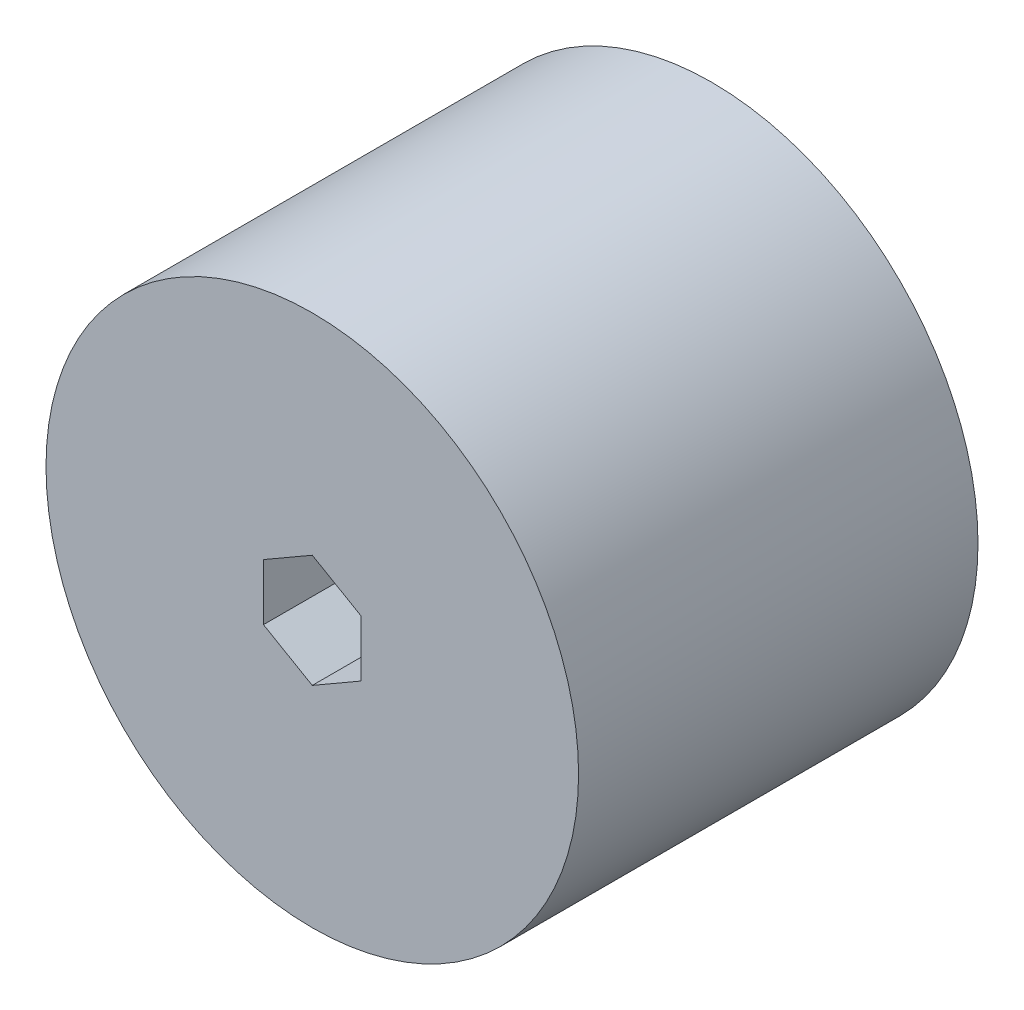
ISO-10303-21;
HEADER;
FILE_DESCRIPTION(('STEP AP214'),'2;1');
FILE_NAME('part.step','',(''),(''),'','','');
FILE_SCHEMA(('AUTOMOTIVE_DESIGN { 1 0 10303 214 1 1 1 1 }'));
ENDSEC;
DATA;
#1=APPLICATION_CONTEXT('core data for automotive mechanical design processes');
#2=APPLICATION_PROTOCOL_DEFINITION('international standard','automotive_design',2000,#1);
#3=PRODUCT_CONTEXT('',#1,'mechanical');
#4=PRODUCT('Part','Part','',(#3));
#5=PRODUCT_RELATED_PRODUCT_CATEGORY('part','',(#4));
#6=PRODUCT_DEFINITION_FORMATION('','',#4);
#7=PRODUCT_DEFINITION_CONTEXT('part definition',#1,'design');
#8=PRODUCT_DEFINITION('design','',#6,#7);
#9=PRODUCT_DEFINITION_SHAPE('','',#8);
#10=(LENGTH_UNIT() NAMED_UNIT(*) SI_UNIT(.MILLI.,.METRE.));
#11=(NAMED_UNIT(*) PLANE_ANGLE_UNIT() SI_UNIT($,.RADIAN.));
#12=(NAMED_UNIT(*) SI_UNIT($,.STERADIAN.) SOLID_ANGLE_UNIT());
#13=UNCERTAINTY_MEASURE_WITH_UNIT(LENGTH_MEASURE(1.E-05),#10,'distance_accuracy_value','');
#14=(GEOMETRIC_REPRESENTATION_CONTEXT(3) GLOBAL_UNCERTAINTY_ASSIGNED_CONTEXT((#13)) GLOBAL_UNIT_ASSIGNED_CONTEXT((#10,
#11,#12)) REPRESENTATION_CONTEXT('',''));
#15=CARTESIAN_POINT('',(0.,0.,0.));
#16=DIRECTION('',(0.,0.,1.));
#17=DIRECTION('',(1.,0.,0.));
#18=AXIS2_PLACEMENT_3D('',#15,#16,#17);
#19=CARTESIAN_POINT('',(0.,0.,57.15));
#20=DIRECTION('',(0.,0.,1.));
#21=DIRECTION('',(1.,0.,0.));
#22=AXIS2_PLACEMENT_3D('',#19,#20,#21);
#23=PLANE('',#22);
#24=CARTESIAN_POINT('',(0.,0.,57.15));
#25=DIRECTION('',(0.,0.,1.));
#26=DIRECTION('',(1.,0.,0.));
#27=AXIS2_PLACEMENT_3D('',#24,#25,#26);
#28=CIRCLE('',#27,38.1);
#29=CARTESIAN_POINT('',(38.1,0.,57.15));
#30=VERTEX_POINT('',#29);
#31=EDGE_CURVE('E11',#30,#30,#28,.T.);
#32=ORIENTED_EDGE('',*,*,#31,.T.);
#33=EDGE_LOOP('',(#32));
#34=FACE_BOUND('',#33,.T.);
#35=DIRECTION('',(-0.866025403784439,-0.5,0.));
#36=VECTOR('',#35,1.);
#37=CARTESIAN_POINT('',(0.,8.06558326057907,57.15));
#38=LINE('',#37,#36);
#39=CARTESIAN_POINT('',(0.,8.06558326057907,57.15));
#40=VERTEX_POINT('',#39);
#41=CARTESIAN_POINT('',(-6.985,4.03279163028954,57.15));
#42=VERTEX_POINT('',#41);
#43=EDGE_CURVE('E108',#40,#42,#38,.T.);
#44=ORIENTED_EDGE('',*,*,#43,.F.);
#45=DIRECTION('',(-0.866025403784439,0.5,0.));
#46=VECTOR('',#45,1.);
#47=CARTESIAN_POINT('',(6.985,4.03279163028954,57.15));
#48=LINE('',#47,#46);
#49=CARTESIAN_POINT('',(6.985,4.03279163028954,57.15));
#50=VERTEX_POINT('',#49);
#51=EDGE_CURVE('E99',#50,#40,#48,.T.);
#52=ORIENTED_EDGE('',*,*,#51,.F.);
#53=DIRECTION('',(0.,1.,0.));
#54=VECTOR('',#53,1.);
#55=CARTESIAN_POINT('',(6.985,-4.03279163028954,57.15));
#56=LINE('',#55,#54);
#57=CARTESIAN_POINT('',(6.985,-4.03279163028954,57.15));
#58=VERTEX_POINT('',#57);
#59=EDGE_CURVE('E133',#58,#50,#56,.T.);
#60=ORIENTED_EDGE('',*,*,#59,.F.);
#61=DIRECTION('',(0.866025403784439,0.5,0.));
#62=VECTOR('',#61,1.);
#63=CARTESIAN_POINT('',(0.,-8.06558326057907,57.15));
#64=LINE('',#63,#62);
#65=CARTESIAN_POINT('',(0.,-8.06558326057907,57.15));
#66=VERTEX_POINT('',#65);
#67=EDGE_CURVE('E130',#66,#58,#64,.T.);
#68=ORIENTED_EDGE('',*,*,#67,.F.);
#69=DIRECTION('',(0.866025403784439,-0.5,0.));
#70=VECTOR('',#69,1.);
#71=CARTESIAN_POINT('',(-6.985,-4.03279163028954,57.15));
#72=LINE('',#71,#70);
#73=CARTESIAN_POINT('',(-6.985,-4.03279163028954,57.15));
#74=VERTEX_POINT('',#73);
#75=EDGE_CURVE('E125',#74,#66,#72,.T.);
#76=ORIENTED_EDGE('',*,*,#75,.F.);
#77=DIRECTION('',(0.,-1.,0.));
#78=VECTOR('',#77,1.);
#79=CARTESIAN_POINT('',(-6.985,4.03279163028954,57.15));
#80=LINE('',#79,#78);
#81=EDGE_CURVE('E121',#42,#74,#80,.T.);
#82=ORIENTED_EDGE('',*,*,#81,.F.);
#83=EDGE_LOOP('',(#44,#52,#60,#68,#76,#82));
#84=FACE_BOUND('',#83,.T.);
#85=ADVANCED_FACE('F45',(#34,#84),#23,.T.);
#86=CARTESIAN_POINT('',(0.,0.,0.));
#87=DIRECTION('',(0.,0.,1.));
#88=DIRECTION('',(1.,0.,0.));
#89=AXIS2_PLACEMENT_3D('',#86,#87,#88);
#90=PLANE('',#89);
#91=CARTESIAN_POINT('',(0.,0.,0.));
#92=DIRECTION('',(0.,0.,1.));
#93=DIRECTION('',(1.,0.,0.));
#94=AXIS2_PLACEMENT_3D('',#91,#92,#93);
#95=CIRCLE('',#94,38.1);
#96=CARTESIAN_POINT('',(38.1,0.,0.));
#97=VERTEX_POINT('',#96);
#98=EDGE_CURVE('E49',#97,#97,#95,.T.);
#99=ORIENTED_EDGE('',*,*,#98,.F.);
#100=EDGE_LOOP('',(#99));
#101=FACE_BOUND('',#100,.T.);
#102=DIRECTION('',(-0.866025403784439,0.5,0.));
#103=VECTOR('',#102,1.);
#104=CARTESIAN_POINT('',(6.985,4.03279163028954,0.));
#105=LINE('',#104,#103);
#106=CARTESIAN_POINT('',(6.985,4.03279163028954,0.));
#107=VERTEX_POINT('',#106);
#108=CARTESIAN_POINT('',(0.,8.06558326057907,0.));
#109=VERTEX_POINT('',#108);
#110=EDGE_CURVE('E69',#107,#109,#105,.T.);
#111=ORIENTED_EDGE('',*,*,#110,.T.);
#112=DIRECTION('',(-0.866025403784439,-0.5,0.));
#113=VECTOR('',#112,1.);
#114=CARTESIAN_POINT('',(0.,8.06558326057907,0.));
#115=LINE('',#114,#113);
#116=CARTESIAN_POINT('',(-6.985,4.03279163028954,0.));
#117=VERTEX_POINT('',#116);
#118=EDGE_CURVE('E115',#109,#117,#115,.T.);
#119=ORIENTED_EDGE('',*,*,#118,.T.);
#120=DIRECTION('',(0.,-1.,0.));
#121=VECTOR('',#120,1.);
#122=CARTESIAN_POINT('',(-6.985,4.03279163028954,0.));
#123=LINE('',#122,#121);
#124=CARTESIAN_POINT('',(-6.985,-4.03279163028954,0.));
#125=VERTEX_POINT('',#124);
#126=EDGE_CURVE('E140',#117,#125,#123,.T.);
#127=ORIENTED_EDGE('',*,*,#126,.T.);
#128=DIRECTION('',(0.866025403784439,-0.5,0.));
#129=VECTOR('',#128,1.);
#130=CARTESIAN_POINT('',(-6.985,-4.03279163028954,0.));
#131=LINE('',#130,#129);
#132=CARTESIAN_POINT('',(0.,-8.06558326057907,0.));
#133=VERTEX_POINT('',#132);
#134=EDGE_CURVE('E144',#125,#133,#131,.T.);
#135=ORIENTED_EDGE('',*,*,#134,.T.);
#136=DIRECTION('',(0.866025403784439,0.5,0.));
#137=VECTOR('',#136,1.);
#138=CARTESIAN_POINT('',(0.,-8.06558326057907,0.));
#139=LINE('',#138,#137);
#140=CARTESIAN_POINT('',(6.985,-4.03279163028954,0.));
#141=VERTEX_POINT('',#140);
#142=EDGE_CURVE('E148',#133,#141,#139,.T.);
#143=ORIENTED_EDGE('',*,*,#142,.T.);
#144=DIRECTION('',(0.,1.,0.));
#145=VECTOR('',#144,1.);
#146=CARTESIAN_POINT('',(6.985,-4.03279163028954,0.));
#147=LINE('',#146,#145);
#148=EDGE_CURVE('E109',#141,#107,#147,.T.);
#149=ORIENTED_EDGE('',*,*,#148,.T.);
#150=EDGE_LOOP('',(#111,#119,#127,#135,#143,#149));
#151=FACE_BOUND('',#150,.T.);
#152=ADVANCED_FACE('F172',(#101,#151),#90,.F.);
#153=CARTESIAN_POINT('',(0.,0.,57.15));
#154=DIRECTION('',(0.,0.,-1.));
#155=DIRECTION('',(-1.,0.,0.));
#156=AXIS2_PLACEMENT_3D('',#153,#154,#155);
#157=CYLINDRICAL_SURFACE('',#156,38.1);
#158=ORIENTED_EDGE('',*,*,#31,.F.);
#159=EDGE_LOOP('',(#158));
#160=FACE_BOUND('',#159,.T.);
#161=ORIENTED_EDGE('',*,*,#98,.T.);
#162=EDGE_LOOP('',(#161));
#163=FACE_BOUND('',#162,.T.);
#164=ADVANCED_FACE('F47',(#160,#163),#157,.T.);
#165=CARTESIAN_POINT('',(6.985,4.03279163028954,57.15));
#166=DIRECTION('',(-0.5,-0.866025403784439,0.));
#167=DIRECTION('',(0.866025403784439,-0.5,0.));
#168=AXIS2_PLACEMENT_3D('',#165,#166,#167);
#169=PLANE('',#168);
#170=ORIENTED_EDGE('',*,*,#110,.F.);
#171=DIRECTION('',(0.,0.,-1.));
#172=VECTOR('',#171,1.);
#173=CARTESIAN_POINT('',(6.985,4.03279163028954,57.15));
#174=LINE('',#173,#172);
#175=EDGE_CURVE('E103',#50,#107,#174,.T.);
#176=ORIENTED_EDGE('',*,*,#175,.F.);
#177=ORIENTED_EDGE('',*,*,#51,.T.);
#178=DIRECTION('',(0.,0.,-1.));
#179=VECTOR('',#178,1.);
#180=CARTESIAN_POINT('',(0.,8.06558326057907,57.15));
#181=LINE('',#180,#179);
#182=EDGE_CURVE('E102',#40,#109,#181,.T.);
#183=ORIENTED_EDGE('',*,*,#182,.T.);
#184=EDGE_LOOP('',(#170,#176,#177,#183));
#185=FACE_BOUND('',#184,.T.);
#186=ADVANCED_FACE('F101',(#185),#169,.T.);
#187=CARTESIAN_POINT('',(0.,8.06558326057907,57.15));
#188=DIRECTION('',(0.5,-0.866025403784439,0.));
#189=DIRECTION('',(0.866025403784439,0.5,0.));
#190=AXIS2_PLACEMENT_3D('',#187,#188,#189);
#191=PLANE('',#190);
#192=ORIENTED_EDGE('',*,*,#118,.F.);
#193=ORIENTED_EDGE('',*,*,#182,.F.);
#194=ORIENTED_EDGE('',*,*,#43,.T.);
#195=DIRECTION('',(0.,0.,-1.));
#196=VECTOR('',#195,1.);
#197=CARTESIAN_POINT('',(-6.985,4.03279163028954,57.15));
#198=LINE('',#197,#196);
#199=EDGE_CURVE('E117',#42,#117,#198,.T.);
#200=ORIENTED_EDGE('',*,*,#199,.T.);
#201=EDGE_LOOP('',(#192,#193,#194,#200));
#202=FACE_BOUND('',#201,.T.);
#203=ADVANCED_FACE('F112',(#202),#191,.T.);
#204=CARTESIAN_POINT('',(-6.985,4.03279163028954,57.15));
#205=DIRECTION('',(1.,0.,0.));
#206=DIRECTION('',(0.,1.,0.));
#207=AXIS2_PLACEMENT_3D('',#204,#205,#206);
#208=PLANE('',#207);
#209=ORIENTED_EDGE('',*,*,#126,.F.);
#210=ORIENTED_EDGE('',*,*,#199,.F.);
#211=ORIENTED_EDGE('',*,*,#81,.T.);
#212=DIRECTION('',(0.,0.,-1.));
#213=VECTOR('',#212,1.);
#214=CARTESIAN_POINT('',(-6.985,-4.03279163028954,57.15));
#215=LINE('',#214,#213);
#216=EDGE_CURVE('E162',#74,#125,#215,.T.);
#217=ORIENTED_EDGE('',*,*,#216,.T.);
#218=EDGE_LOOP('',(#209,#210,#211,#217));
#219=FACE_BOUND('',#218,.T.);
#220=ADVANCED_FACE('F168',(#219),#208,.T.);
#221=CARTESIAN_POINT('',(-6.985,-4.03279163028954,57.15));
#222=DIRECTION('',(0.5,0.866025403784439,0.));
#223=DIRECTION('',(-0.866025403784439,0.5,0.));
#224=AXIS2_PLACEMENT_3D('',#221,#222,#223);
#225=PLANE('',#224);
#226=ORIENTED_EDGE('',*,*,#134,.F.);
#227=ORIENTED_EDGE('',*,*,#216,.F.);
#228=ORIENTED_EDGE('',*,*,#75,.T.);
#229=DIRECTION('',(0.,0.,-1.));
#230=VECTOR('',#229,1.);
#231=CARTESIAN_POINT('',(0.,-8.06558326057907,57.15));
#232=LINE('',#231,#230);
#233=EDGE_CURVE('E159',#66,#133,#232,.T.);
#234=ORIENTED_EDGE('',*,*,#233,.T.);
#235=EDGE_LOOP('',(#226,#227,#228,#234));
#236=FACE_BOUND('',#235,.T.);
#237=ADVANCED_FACE('F180',(#236),#225,.T.);
#238=CARTESIAN_POINT('',(0.,-8.06558326057907,57.15));
#239=DIRECTION('',(-0.5,0.866025403784439,0.));
#240=DIRECTION('',(-0.866025403784439,-0.5,0.));
#241=AXIS2_PLACEMENT_3D('',#238,#239,#240);
#242=PLANE('',#241);
#243=ORIENTED_EDGE('',*,*,#142,.F.);
#244=ORIENTED_EDGE('',*,*,#233,.F.);
#245=ORIENTED_EDGE('',*,*,#67,.T.);
#246=DIRECTION('',(0.,0.,-1.));
#247=VECTOR('',#246,1.);
#248=CARTESIAN_POINT('',(6.985,-4.03279163028954,57.15));
#249=LINE('',#248,#247);
#250=EDGE_CURVE('E61',#58,#141,#249,.T.);
#251=ORIENTED_EDGE('',*,*,#250,.T.);
#252=EDGE_LOOP('',(#243,#244,#245,#251));
#253=FACE_BOUND('',#252,.T.);
#254=ADVANCED_FACE('F178',(#253),#242,.T.);
#255=CARTESIAN_POINT('',(6.985,-4.03279163028954,57.15));
#256=DIRECTION('',(-1.,0.,0.));
#257=DIRECTION('',(0.,-1.,0.));
#258=AXIS2_PLACEMENT_3D('',#255,#256,#257);
#259=PLANE('',#258);
#260=ORIENTED_EDGE('',*,*,#148,.F.);
#261=ORIENTED_EDGE('',*,*,#250,.F.);
#262=ORIENTED_EDGE('',*,*,#59,.T.);
#263=ORIENTED_EDGE('',*,*,#175,.T.);
#264=EDGE_LOOP('',(#260,#261,#262,#263));
#265=FACE_BOUND('',#264,.T.);
#266=ADVANCED_FACE('F174',(#265),#259,.T.);
#267=CLOSED_SHELL('',(#85,#152,#164,#186,#203,#220,#237,#254,#266));
#268=MANIFOLD_SOLID_BREP('B2',#267);
#269=ADVANCED_BREP_SHAPE_REPRESENTATION('',(#18,#268),#14);
#270=SHAPE_DEFINITION_REPRESENTATION(#9,#269);
ENDSEC;
END-ISO-10303-21;
